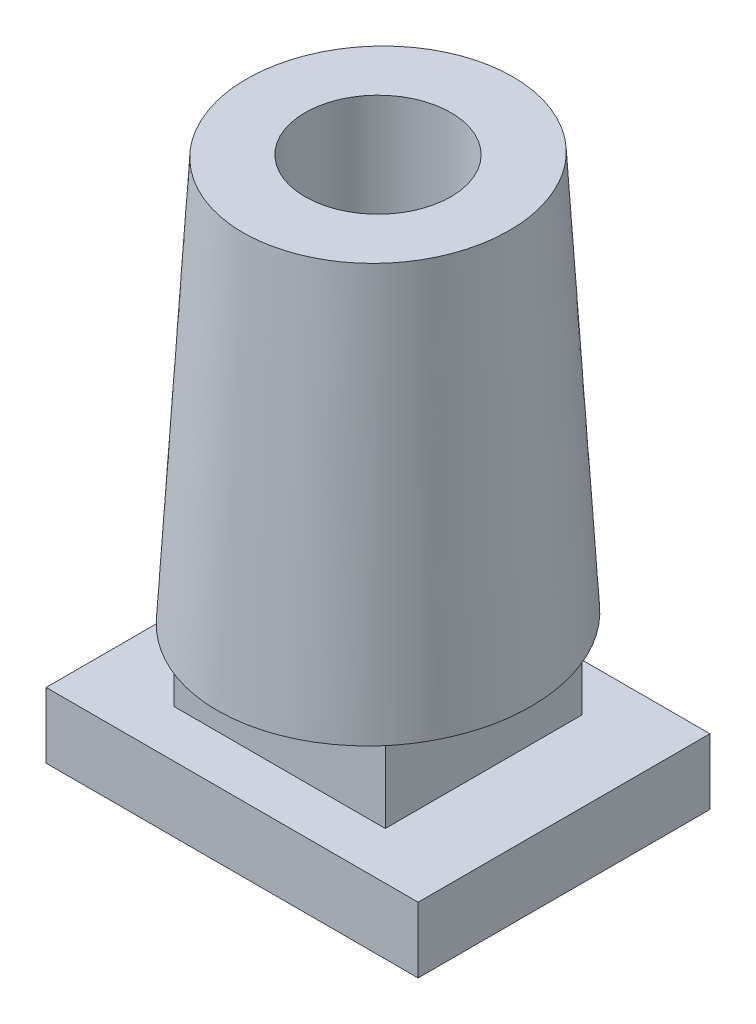
ISO-10303-21;
HEADER;
FILE_DESCRIPTION(('STEP AP214'),'2;1');
FILE_NAME('part.step','',(''),(''),'','','');
FILE_SCHEMA(('AUTOMOTIVE_DESIGN { 1 0 10303 214 1 1 1 1 }'));
ENDSEC;
DATA;
#1=APPLICATION_CONTEXT('core data for automotive mechanical design processes');
#2=APPLICATION_PROTOCOL_DEFINITION('international standard','automotive_design',2000,#1);
#3=PRODUCT_CONTEXT('',#1,'mechanical');
#4=PRODUCT('Part','Part','',(#3));
#5=PRODUCT_RELATED_PRODUCT_CATEGORY('part','',(#4));
#6=PRODUCT_DEFINITION_FORMATION('','',#4);
#7=PRODUCT_DEFINITION_CONTEXT('part definition',#1,'design');
#8=PRODUCT_DEFINITION('design','',#6,#7);
#9=PRODUCT_DEFINITION_SHAPE('','',#8);
#10=(LENGTH_UNIT() NAMED_UNIT(*) SI_UNIT(.MILLI.,.METRE.));
#11=(NAMED_UNIT(*) PLANE_ANGLE_UNIT() SI_UNIT($,.RADIAN.));
#12=(NAMED_UNIT(*) SI_UNIT($,.STERADIAN.) SOLID_ANGLE_UNIT());
#13=UNCERTAINTY_MEASURE_WITH_UNIT(LENGTH_MEASURE(1.E-05),#10,'distance_accuracy_value','');
#14=(GEOMETRIC_REPRESENTATION_CONTEXT(3) GLOBAL_UNCERTAINTY_ASSIGNED_CONTEXT((#13)) GLOBAL_UNIT_ASSIGNED_CONTEXT((#10,
#11,#12)) REPRESENTATION_CONTEXT('',''));
#15=CARTESIAN_POINT('',(0.,0.,0.));
#16=DIRECTION('',(0.,0.,1.));
#17=DIRECTION('',(1.,0.,0.));
#18=AXIS2_PLACEMENT_3D('',#15,#16,#17);
#19=CARTESIAN_POINT('',(0.,1.8,0.));
#20=DIRECTION('',(0.,-1.,0.));
#21=DIRECTION('',(0.,0.,-1.));
#22=AXIS2_PLACEMENT_3D('',#19,#20,#21);
#23=PLANE('',#22);
#24=DIRECTION('',(0.,0.,-1.));
#25=VECTOR('',#24,1.);
#26=CARTESIAN_POINT('',(5.1,1.8,4.));
#27=LINE('',#26,#25);
#28=CARTESIAN_POINT('',(5.1,1.8,4.));
#29=VERTEX_POINT('',#28);
#30=CARTESIAN_POINT('',(5.1,1.8,-4.));
#31=VERTEX_POINT('',#30);
#32=EDGE_CURVE('E159',#29,#31,#27,.T.);
#33=ORIENTED_EDGE('',*,*,#32,.T.);
#34=DIRECTION('',(-1.,0.,0.));
#35=VECTOR('',#34,1.);
#36=CARTESIAN_POINT('',(-5.1,1.8,-4.));
#37=LINE('',#36,#35);
#38=CARTESIAN_POINT('',(-5.1,1.8,-4.));
#39=VERTEX_POINT('',#38);
#40=EDGE_CURVE('E162',#31,#39,#37,.T.);
#41=ORIENTED_EDGE('',*,*,#40,.T.);
#42=DIRECTION('',(0.,0.,1.));
#43=VECTOR('',#42,1.);
#44=CARTESIAN_POINT('',(-5.1,1.8,4.));
#45=LINE('',#44,#43);
#46=CARTESIAN_POINT('',(-5.1,1.8,4.));
#47=VERTEX_POINT('',#46);
#48=EDGE_CURVE('E165',#39,#47,#45,.T.);
#49=ORIENTED_EDGE('',*,*,#48,.T.);
#50=DIRECTION('',(1.,0.,0.));
#51=VECTOR('',#50,1.);
#52=CARTESIAN_POINT('',(-5.1,1.8,4.));
#53=LINE('',#52,#51);
#54=EDGE_CURVE('E167',#47,#29,#53,.T.);
#55=ORIENTED_EDGE('',*,*,#54,.T.);
#56=EDGE_LOOP('',(#33,#41,#49,#55));
#57=FACE_BOUND('',#56,.T.);
#58=DIRECTION('',(0.,0.,-1.));
#59=VECTOR('',#58,1.);
#60=CARTESIAN_POINT('',(2.9,1.8,2.7));
#61=LINE('',#60,#59);
#62=CARTESIAN_POINT('',(2.9,1.8,2.7));
#63=VERTEX_POINT('',#62);
#64=CARTESIAN_POINT('',(2.9,1.8,-2.7));
#65=VERTEX_POINT('',#64);
#66=EDGE_CURVE('E70',#63,#65,#61,.T.);
#67=ORIENTED_EDGE('',*,*,#66,.F.);
#68=DIRECTION('',(1.,0.,0.));
#69=VECTOR('',#68,1.);
#70=CARTESIAN_POINT('',(-2.9,1.8,2.7));
#71=LINE('',#70,#69);
#72=CARTESIAN_POINT('',(-2.9,1.8,2.7));
#73=VERTEX_POINT('',#72);
#74=EDGE_CURVE('E74',#73,#63,#71,.T.);
#75=ORIENTED_EDGE('',*,*,#74,.F.);
#76=DIRECTION('',(0.,0.,1.));
#77=VECTOR('',#76,1.);
#78=CARTESIAN_POINT('',(-2.9,1.8,2.7));
#79=LINE('',#78,#77);
#80=CARTESIAN_POINT('',(-2.9,1.8,-2.7));
#81=VERTEX_POINT('',#80);
#82=EDGE_CURVE('E150',#81,#73,#79,.T.);
#83=ORIENTED_EDGE('',*,*,#82,.F.);
#84=DIRECTION('',(-1.,0.,0.));
#85=VECTOR('',#84,1.);
#86=CARTESIAN_POINT('',(-2.9,1.8,-2.7));
#87=LINE('',#86,#85);
#88=EDGE_CURVE('E146',#65,#81,#87,.T.);
#89=ORIENTED_EDGE('',*,*,#88,.F.);
#90=EDGE_LOOP('',(#67,#75,#83,#89));
#91=FACE_BOUND('',#90,.T.);
#92=ADVANCED_FACE('F55',(#57,#91),#23,.F.);
#93=CARTESIAN_POINT('',(5.1,1.8,4.));
#94=DIRECTION('',(-1.,0.,0.));
#95=DIRECTION('',(0.,0.,1.));
#96=AXIS2_PLACEMENT_3D('',#93,#94,#95);
#97=PLANE('',#96);
#98=DIRECTION('',(0.,0.,-1.));
#99=VECTOR('',#98,1.);
#100=CARTESIAN_POINT('',(5.1,0.,4.));
#101=LINE('',#100,#99);
#102=CARTESIAN_POINT('',(5.1,0.,4.));
#103=VERTEX_POINT('',#102);
#104=CARTESIAN_POINT('',(5.1,0.,-4.));
#105=VERTEX_POINT('',#104);
#106=EDGE_CURVE('E158',#103,#105,#101,.T.);
#107=ORIENTED_EDGE('',*,*,#106,.T.);
#108=DIRECTION('',(0.,-1.,0.));
#109=VECTOR('',#108,1.);
#110=CARTESIAN_POINT('',(5.1,1.8,-4.));
#111=LINE('',#110,#109);
#112=EDGE_CURVE('E12',#31,#105,#111,.T.);
#113=ORIENTED_EDGE('',*,*,#112,.F.);
#114=ORIENTED_EDGE('',*,*,#32,.F.);
#115=DIRECTION('',(0.,-1.,0.));
#116=VECTOR('',#115,1.);
#117=CARTESIAN_POINT('',(5.1,1.8,4.));
#118=LINE('',#117,#116);
#119=EDGE_CURVE('E169',#29,#103,#118,.T.);
#120=ORIENTED_EDGE('',*,*,#119,.T.);
#121=EDGE_LOOP('',(#107,#113,#114,#120));
#122=FACE_BOUND('',#121,.T.);
#123=ADVANCED_FACE('F57',(#122),#97,.F.);
#124=CARTESIAN_POINT('',(-5.1,1.8,-4.));
#125=DIRECTION('',(0.,0.,1.));
#126=DIRECTION('',(1.,0.,0.));
#127=AXIS2_PLACEMENT_3D('',#124,#125,#126);
#128=PLANE('',#127);
#129=DIRECTION('',(-1.,0.,0.));
#130=VECTOR('',#129,1.);
#131=CARTESIAN_POINT('',(-5.1,0.,-4.));
#132=LINE('',#131,#130);
#133=CARTESIAN_POINT('',(-5.1,0.,-4.));
#134=VERTEX_POINT('',#133);
#135=EDGE_CURVE('E172',#105,#134,#132,.T.);
#136=ORIENTED_EDGE('',*,*,#135,.T.);
#137=DIRECTION('',(0.,-1.,0.));
#138=VECTOR('',#137,1.);
#139=CARTESIAN_POINT('',(-5.1,1.8,-4.));
#140=LINE('',#139,#138);
#141=EDGE_CURVE('E63',#39,#134,#140,.T.);
#142=ORIENTED_EDGE('',*,*,#141,.F.);
#143=ORIENTED_EDGE('',*,*,#40,.F.);
#144=ORIENTED_EDGE('',*,*,#112,.T.);
#145=EDGE_LOOP('',(#136,#142,#143,#144));
#146=FACE_BOUND('',#145,.T.);
#147=ADVANCED_FACE('F201',(#146),#128,.F.);
#148=CARTESIAN_POINT('',(-5.1,1.8,4.));
#149=DIRECTION('',(1.,0.,0.));
#150=DIRECTION('',(0.,0.,-1.));
#151=AXIS2_PLACEMENT_3D('',#148,#149,#150);
#152=PLANE('',#151);
#153=DIRECTION('',(0.,0.,1.));
#154=VECTOR('',#153,1.);
#155=CARTESIAN_POINT('',(-5.1,0.,4.));
#156=LINE('',#155,#154);
#157=CARTESIAN_POINT('',(-5.1,0.,4.));
#158=VERTEX_POINT('',#157);
#159=EDGE_CURVE('E174',#134,#158,#156,.T.);
#160=ORIENTED_EDGE('',*,*,#159,.T.);
#161=DIRECTION('',(0.,-1.,0.));
#162=VECTOR('',#161,1.);
#163=CARTESIAN_POINT('',(-5.1,1.8,4.));
#164=LINE('',#163,#162);
#165=EDGE_CURVE('E179',#47,#158,#164,.T.);
#166=ORIENTED_EDGE('',*,*,#165,.F.);
#167=ORIENTED_EDGE('',*,*,#48,.F.);
#168=ORIENTED_EDGE('',*,*,#141,.T.);
#169=EDGE_LOOP('',(#160,#166,#167,#168));
#170=FACE_BOUND('',#169,.T.);
#171=ADVANCED_FACE('F186',(#170),#152,.F.);
#172=CARTESIAN_POINT('',(-5.1,1.8,4.));
#173=DIRECTION('',(0.,0.,-1.));
#174=DIRECTION('',(-1.,0.,0.));
#175=AXIS2_PLACEMENT_3D('',#172,#173,#174);
#176=PLANE('',#175);
#177=DIRECTION('',(1.,0.,0.));
#178=VECTOR('',#177,1.);
#179=CARTESIAN_POINT('',(-5.1,0.,4.));
#180=LINE('',#179,#178);
#181=EDGE_CURVE('E163',#158,#103,#180,.T.);
#182=ORIENTED_EDGE('',*,*,#181,.T.);
#183=ORIENTED_EDGE('',*,*,#119,.F.);
#184=ORIENTED_EDGE('',*,*,#54,.F.);
#185=ORIENTED_EDGE('',*,*,#165,.T.);
#186=EDGE_LOOP('',(#182,#183,#184,#185));
#187=FACE_BOUND('',#186,.T.);
#188=ADVANCED_FACE('F195',(#187),#176,.F.);
#189=CARTESIAN_POINT('',(0.,0.,0.));
#190=DIRECTION('',(0.,-1.,0.));
#191=DIRECTION('',(0.,0.,-1.));
#192=AXIS2_PLACEMENT_3D('',#189,#190,#191);
#193=PLANE('',#192);
#194=CARTESIAN_POINT('',(0.,0.,0.));
#195=DIRECTION('',(0.,1.,0.));
#196=DIRECTION('',(0.,0.,1.));
#197=AXIS2_PLACEMENT_3D('',#194,#195,#196);
#198=CIRCLE('',#197,2.);
#199=CARTESIAN_POINT('',(0.,0.,2.));
#200=VERTEX_POINT('',#199);
#201=EDGE_CURVE('E373',#200,#200,#198,.T.);
#202=ORIENTED_EDGE('',*,*,#201,.T.);
#203=EDGE_LOOP('',(#202));
#204=FACE_BOUND('',#203,.T.);
#205=ORIENTED_EDGE('',*,*,#106,.F.);
#206=ORIENTED_EDGE('',*,*,#181,.F.);
#207=ORIENTED_EDGE('',*,*,#159,.F.);
#208=ORIENTED_EDGE('',*,*,#135,.F.);
#209=EDGE_LOOP('',(#205,#206,#207,#208));
#210=FACE_BOUND('',#209,.T.);
#211=ADVANCED_FACE('F192',(#204,#210),#193,.T.);
#212=CARTESIAN_POINT('',(2.9,4.,2.7));
#213=DIRECTION('',(-1.,0.,0.));
#214=DIRECTION('',(0.,0.,1.));
#215=AXIS2_PLACEMENT_3D('',#212,#213,#214);
#216=PLANE('',#215);
#217=ORIENTED_EDGE('',*,*,#66,.T.);
#218=DIRECTION('',(0.,-1.,0.));
#219=VECTOR('',#218,1.);
#220=CARTESIAN_POINT('',(2.9,4.,-2.7));
#221=LINE('',#220,#219);
#222=CARTESIAN_POINT('',(2.9,4.,-2.7));
#223=VERTEX_POINT('',#222);
#224=EDGE_CURVE('E124',#223,#65,#221,.T.);
#225=ORIENTED_EDGE('',*,*,#224,.F.);
#226=DIRECTION('',(0.,0.,-1.));
#227=VECTOR('',#226,1.);
#228=CARTESIAN_POINT('',(2.9,4.,2.7));
#229=LINE('',#228,#227);
#230=CARTESIAN_POINT('',(2.9,4.,2.7));
#231=VERTEX_POINT('',#230);
#232=EDGE_CURVE('E119',#231,#223,#229,.T.);
#233=ORIENTED_EDGE('',*,*,#232,.F.);
#234=DIRECTION('',(0.,-1.,0.));
#235=VECTOR('',#234,1.);
#236=CARTESIAN_POINT('',(2.9,4.,2.7));
#237=LINE('',#236,#235);
#238=EDGE_CURVE('E122',#231,#63,#237,.T.);
#239=ORIENTED_EDGE('',*,*,#238,.T.);
#240=EDGE_LOOP('',(#217,#225,#233,#239));
#241=FACE_BOUND('',#240,.T.);
#242=ADVANCED_FACE('F121',(#241),#216,.F.);
#243=CARTESIAN_POINT('',(-2.9,4.,-2.7));
#244=DIRECTION('',(0.,0.,1.));
#245=DIRECTION('',(1.,0.,0.));
#246=AXIS2_PLACEMENT_3D('',#243,#244,#245);
#247=PLANE('',#246);
#248=ORIENTED_EDGE('',*,*,#88,.T.);
#249=DIRECTION('',(0.,-1.,0.));
#250=VECTOR('',#249,1.);
#251=CARTESIAN_POINT('',(-2.9,4.,-2.7));
#252=LINE('',#251,#250);
#253=CARTESIAN_POINT('',(-2.9,4.,-2.7));
#254=VERTEX_POINT('',#253);
#255=EDGE_CURVE('E154',#254,#81,#252,.T.);
#256=ORIENTED_EDGE('',*,*,#255,.F.);
#257=DIRECTION('',(-1.,0.,0.));
#258=VECTOR('',#257,1.);
#259=CARTESIAN_POINT('',(-2.9,4.,-2.7));
#260=LINE('',#259,#258);
#261=EDGE_CURVE('E128',#223,#254,#260,.T.);
#262=ORIENTED_EDGE('',*,*,#261,.F.);
#263=ORIENTED_EDGE('',*,*,#224,.T.);
#264=EDGE_LOOP('',(#248,#256,#262,#263));
#265=FACE_BOUND('',#264,.T.);
#266=ADVANCED_FACE('F235',(#265),#247,.F.);
#267=CARTESIAN_POINT('',(-2.9,4.,2.7));
#268=DIRECTION('',(1.,0.,0.));
#269=DIRECTION('',(0.,0.,-1.));
#270=AXIS2_PLACEMENT_3D('',#267,#268,#269);
#271=PLANE('',#270);
#272=ORIENTED_EDGE('',*,*,#82,.T.);
#273=DIRECTION('',(0.,-1.,0.));
#274=VECTOR('',#273,1.);
#275=CARTESIAN_POINT('',(-2.9,4.,2.7));
#276=LINE('',#275,#274);
#277=CARTESIAN_POINT('',(-2.9,4.,2.7));
#278=VERTEX_POINT('',#277);
#279=EDGE_CURVE('E136',#278,#73,#276,.T.);
#280=ORIENTED_EDGE('',*,*,#279,.F.);
#281=DIRECTION('',(0.,0.,1.));
#282=VECTOR('',#281,1.);
#283=CARTESIAN_POINT('',(-2.9,4.,2.7));
#284=LINE('',#283,#282);
#285=EDGE_CURVE('E140',#254,#278,#284,.T.);
#286=ORIENTED_EDGE('',*,*,#285,.F.);
#287=ORIENTED_EDGE('',*,*,#255,.T.);
#288=EDGE_LOOP('',(#272,#280,#286,#287));
#289=FACE_BOUND('',#288,.T.);
#290=ADVANCED_FACE('F241',(#289),#271,.F.);
#291=CARTESIAN_POINT('',(-2.9,4.,2.7));
#292=DIRECTION('',(0.,0.,-1.));
#293=DIRECTION('',(-1.,0.,0.));
#294=AXIS2_PLACEMENT_3D('',#291,#292,#293);
#295=PLANE('',#294);
#296=ORIENTED_EDGE('',*,*,#74,.T.);
#297=ORIENTED_EDGE('',*,*,#238,.F.);
#298=DIRECTION('',(1.,0.,0.));
#299=VECTOR('',#298,1.);
#300=CARTESIAN_POINT('',(-2.9,4.,2.7));
#301=LINE('',#300,#299);
#302=EDGE_CURVE('E134',#278,#231,#301,.T.);
#303=ORIENTED_EDGE('',*,*,#302,.F.);
#304=ORIENTED_EDGE('',*,*,#279,.T.);
#305=EDGE_LOOP('',(#296,#297,#303,#304));
#306=FACE_BOUND('',#305,.T.);
#307=ADVANCED_FACE('F132',(#306),#295,.F.);
#308=CARTESIAN_POINT('',(0.,4.,0.));
#309=DIRECTION('',(0.,1.,0.));
#310=DIRECTION('',(0.,0.,1.));
#311=AXIS2_PLACEMENT_3D('',#308,#309,#310);
#312=PLANE('',#311);
#313=CARTESIAN_POINT('',(0.,4.,0.));
#314=DIRECTION('',(0.,1.,0.));
#315=DIRECTION('',(0.,0.,-1.));
#316=AXIS2_PLACEMENT_3D('',#313,#314,#315);
#317=ELLIPSE('',#316,4.4,4.2);
#318=CARTESIAN_POINT('',(0.,4.,-4.4));
#319=VERTEX_POINT('',#318);
#320=EDGE_CURVE('E147',#319,#319,#317,.T.);
#321=ORIENTED_EDGE('',*,*,#320,.F.);
#322=EDGE_LOOP('',(#321));
#323=FACE_BOUND('',#322,.T.);
#324=ORIENTED_EDGE('',*,*,#302,.T.);
#325=ORIENTED_EDGE('',*,*,#232,.T.);
#326=ORIENTED_EDGE('',*,*,#261,.T.);
#327=ORIENTED_EDGE('',*,*,#285,.T.);
#328=EDGE_LOOP('',(#324,#325,#326,#327));
#329=FACE_BOUND('',#328,.T.);
#330=ADVANCED_FACE('F138',(#323,#329),#312,.F.);
#331=CARTESIAN_POINT('',(0.,15.,0.));
#332=DIRECTION('',(0.,-1.,0.));
#333=DIRECTION('',(0.,0.,-1.));
#334=AXIS2_PLACEMENT_3D('',#331,#332,#333);
#335=PLANE('',#334);
#336=CARTESIAN_POINT('',(0.,15.,0.));
#337=DIRECTION('',(0.,1.,0.));
#338=DIRECTION('',(0.,0.,1.));
#339=AXIS2_PLACEMENT_3D('',#336,#337,#338);
#340=CIRCLE('',#339,2.);
#341=CARTESIAN_POINT('',(0.,15.,2.));
#342=VERTEX_POINT('',#341);
#343=EDGE_CURVE('E381',#342,#342,#340,.T.);
#344=ORIENTED_EDGE('',*,*,#343,.F.);
#345=EDGE_LOOP('',(#344));
#346=FACE_BOUND('',#345,.T.);
#347=CARTESIAN_POINT('',(0.,15.,0.));
#348=DIRECTION('',(0.,-1.,0.));
#349=DIRECTION('',(0.,0.,1.));
#350=AXIS2_PLACEMENT_3D('',#347,#348,#349);
#351=ELLIPSE('',#350,3.7,3.6);
#352=CARTESIAN_POINT('',(0.,15.,3.7));
#353=VERTEX_POINT('',#352);
#354=EDGE_CURVE('E365',#353,#353,#351,.T.);
#355=ORIENTED_EDGE('',*,*,#354,.F.);
#356=EDGE_LOOP('',(#355));
#357=FACE_BOUND('',#356,.T.);
#358=ADVANCED_FACE('F261',(#346,#357),#335,.F.);
#359=CARTESIAN_POINT('',(3.59997441801569,15.,0.0139486383416728));
#360=CARTESIAN_POINT('',(4.19999917095326,4.,0.00276460135325304));
#361=CARTESIAN_POINT('',(3.57283112178325,15.,7.41389605315171));
#362=CARTESIAN_POINT('',(4.1947212956425,4.,8.80276286430293));
#363=CARTESIAN_POINT('',(-3.62711771424814,15.,7.38599877646836));
#364=CARTESIAN_POINT('',(-4.20527704626401,4.,8.79723366159643));
#365=CARTESIAN_POINT('',(-3.59997441801569,15.,-0.0139486383416766));
#366=CARTESIAN_POINT('',(-4.19999917095326,4.,-0.0027646013532525));
#367=CARTESIAN_POINT('',(-3.57283112178324,15.,-7.41389605315171));
#368=CARTESIAN_POINT('',(-4.1947212956425,4.,-8.80276286430294));
#369=CARTESIAN_POINT('',(3.62711771424814,15.,-7.38599877646835));
#370=CARTESIAN_POINT('',(4.20527704626402,4.,-8.79723366159643));
#371=CARTESIAN_POINT('',(3.59997441801569,15.,0.0139486383416728));
#372=CARTESIAN_POINT('',(4.19999917095326,4.,0.00276460135325304));
#373=(BOUNDED_SURFACE() B_SPLINE_SURFACE(3,1,((#359,#360),(#361,#362),(#363,#364),(#365,#366),
(#367,#368),(#369,#370),(#371,#372)),.UNSPECIFIED.,.T.,.F.,.F.) B_SPLINE_SURFACE_WITH_KNOTS((4,
3,4),(2,2),(0.,0.5,1.),(0.,1.),
.UNSPECIFIED.) GEOMETRIC_REPRESENTATION_ITEM() RATIONAL_B_SPLINE_SURFACE(((1.,1.),
(0.333333333333333,0.333333333333333),(0.333333333333333,0.333333333333333),(1.,1.),
(0.333333333333333,0.333333333333333),(0.333333333333333,0.333333333333333),(1.,1.))) REPRESENTATION_ITEM('') SURFACE());
#374=ORIENTED_EDGE('',*,*,#354,.T.);
#375=EDGE_LOOP('',(#374));
#376=FACE_BOUND('',#375,.T.);
#377=ORIENTED_EDGE('',*,*,#320,.T.);
#378=EDGE_LOOP('',(#377));
#379=FACE_BOUND('',#378,.T.);
#380=ADVANCED_FACE('F268',(#376,#379),#373,.T.);
#381=CARTESIAN_POINT('',(0.,0.,0.));
#382=DIRECTION('',(0.,1.,0.));
#383=DIRECTION('',(0.,0.,1.));
#384=AXIS2_PLACEMENT_3D('',#381,#382,#383);
#385=CYLINDRICAL_SURFACE('',#384,2.);
#386=ORIENTED_EDGE('',*,*,#201,.F.);
#387=EDGE_LOOP('',(#386));
#388=FACE_BOUND('',#387,.T.);
#389=ORIENTED_EDGE('',*,*,#343,.T.);
#390=EDGE_LOOP('',(#389));
#391=FACE_BOUND('',#390,.T.);
#392=ADVANCED_FACE('F276',(#388,#391),#385,.F.);
#393=CLOSED_SHELL('',(#92,#123,#147,#171,#188,#211,#242,#266,#290,#307,#330,#358,#380,#392));
#394=MANIFOLD_SOLID_BREP('B2',#393);
#395=ADVANCED_BREP_SHAPE_REPRESENTATION('',(#18,#394),#14);
#396=SHAPE_DEFINITION_REPRESENTATION(#9,#395);
ENDSEC;
END-ISO-10303-21;
